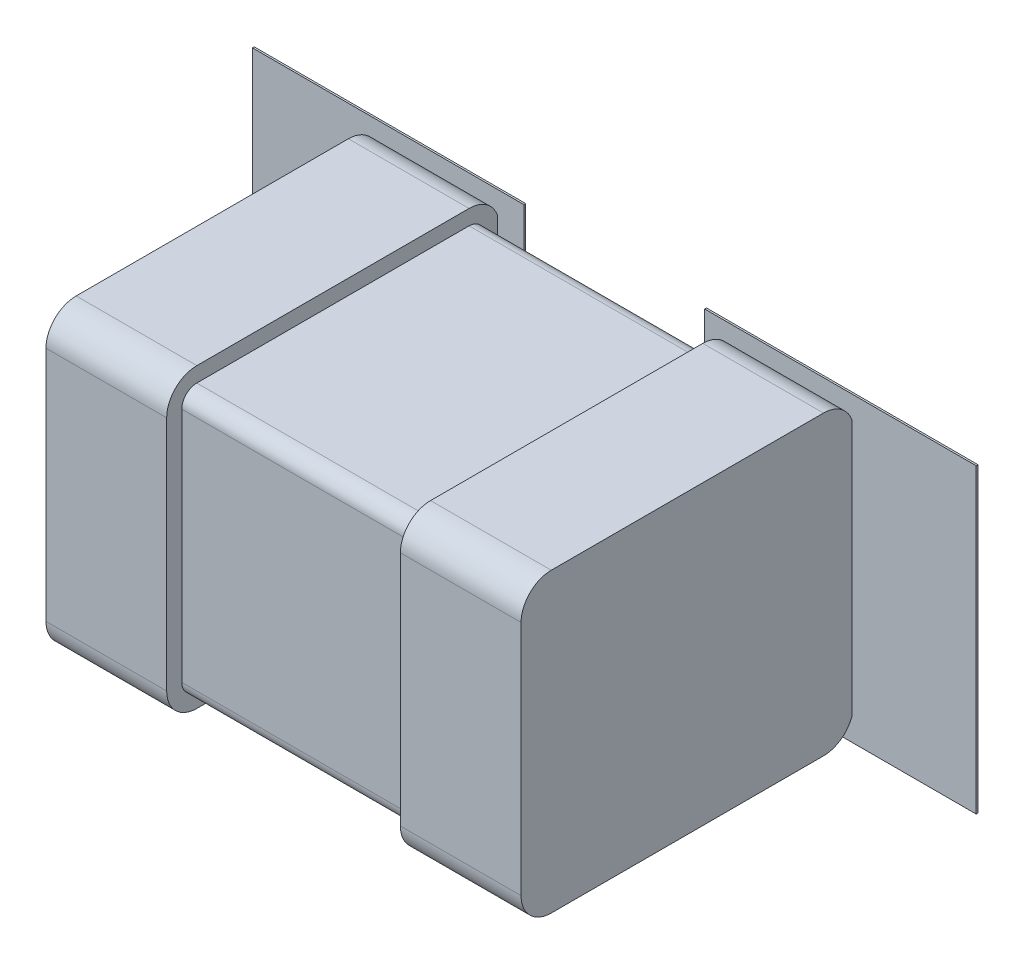
ISO-10303-21;
HEADER;
FILE_DESCRIPTION(('STEP AP214'),'2;1');
FILE_NAME('part.step','',(''),(''),'','','');
FILE_SCHEMA(('AUTOMOTIVE_DESIGN { 1 0 10303 214 1 1 1 1 }'));
ENDSEC;
DATA;
#1=APPLICATION_CONTEXT('core data for automotive mechanical design processes');
#2=APPLICATION_PROTOCOL_DEFINITION('international standard','automotive_design',2000,#1);
#3=PRODUCT_CONTEXT('',#1,'mechanical');
#4=PRODUCT('Part','Part','',(#3));
#5=PRODUCT_RELATED_PRODUCT_CATEGORY('part','',(#4));
#6=PRODUCT_DEFINITION_FORMATION('','',#4);
#7=PRODUCT_DEFINITION_CONTEXT('part definition',#1,'design');
#8=PRODUCT_DEFINITION('design','',#6,#7);
#9=PRODUCT_DEFINITION_SHAPE('','',#8);
#10=(LENGTH_UNIT() NAMED_UNIT(*) SI_UNIT(.MILLI.,.METRE.));
#11=(NAMED_UNIT(*) PLANE_ANGLE_UNIT() SI_UNIT($,.RADIAN.));
#12=(NAMED_UNIT(*) SI_UNIT($,.STERADIAN.) SOLID_ANGLE_UNIT());
#13=UNCERTAINTY_MEASURE_WITH_UNIT(LENGTH_MEASURE(1.E-05),#10,'distance_accuracy_value','');
#14=(GEOMETRIC_REPRESENTATION_CONTEXT(3) GLOBAL_UNCERTAINTY_ASSIGNED_CONTEXT((#13)) GLOBAL_UNIT_ASSIGNED_CONTEXT((#10,
#11,#12)) REPRESENTATION_CONTEXT('',''));
#15=CARTESIAN_POINT('',(0.,0.,0.));
#16=DIRECTION('',(0.,0.,1.));
#17=DIRECTION('',(1.,0.,0.));
#18=AXIS2_PLACEMENT_3D('',#15,#16,#17);
#19=CARTESIAN_POINT('',(0.,0.,0.0762));
#20=DIRECTION('',(0.,0.,1.));
#21=DIRECTION('',(1.,0.,0.));
#22=AXIS2_PLACEMENT_3D('',#19,#20,#21);
#23=PLANE('',#22);
#24=DIRECTION('',(0.,1.,0.));
#25=VECTOR('',#24,1.);
#26=CARTESIAN_POINT('',(0.380492,0.635,0.0762));
#27=LINE('',#26,#25);
#28=CARTESIAN_POINT('',(0.380492,0.635,0.0762));
#29=VERTEX_POINT('',#28);
#30=CARTESIAN_POINT('',(0.380492,-0.635,0.0762));
#31=VERTEX_POINT('',#30);
#32=EDGE_CURVE('E229',#29,#31,#27,.F.);
#33=ORIENTED_EDGE('',*,*,#32,.F.);
#34=DIRECTION('',(1.,0.,0.));
#35=VECTOR('',#34,1.);
#36=CARTESIAN_POINT('',(1.523492,0.635,0.0762));
#37=LINE('',#36,#35);
#38=CARTESIAN_POINT('',(1.523492,0.635,0.0762));
#39=VERTEX_POINT('',#38);
#40=EDGE_CURVE('E216',#39,#29,#37,.F.);
#41=ORIENTED_EDGE('',*,*,#40,.F.);
#42=DIRECTION('',(0.,1.,0.));
#43=VECTOR('',#42,1.);
#44=CARTESIAN_POINT('',(1.523492,-0.635,0.0762));
#45=LINE('',#44,#43);
#46=CARTESIAN_POINT('',(1.523492,-0.635,0.0762));
#47=VERTEX_POINT('',#46);
#48=EDGE_CURVE('E357',#47,#39,#45,.T.);
#49=ORIENTED_EDGE('',*,*,#48,.F.);
#50=DIRECTION('',(1.,0.,0.));
#51=VECTOR('',#50,1.);
#52=CARTESIAN_POINT('',(0.380492,-0.635,0.0762));
#53=LINE('',#52,#51);
#54=EDGE_CURVE('E230',#31,#47,#53,.T.);
#55=ORIENTED_EDGE('',*,*,#54,.F.);
#56=EDGE_LOOP('',(#33,#41,#49,#55));
#57=FACE_BOUND('',#56,.T.);
#58=ADVANCED_FACE('F17',(#57),#23,.F.);
#59=CARTESIAN_POINT('',(1.523492,0.635,0.0762));
#60=DIRECTION('',(0.,1.,0.));
#61=DIRECTION('',(0.,0.,1.));
#62=AXIS2_PLACEMENT_3D('',#59,#60,#61);
#63=PLANE('',#62);
#64=DIRECTION('',(0.,0.,-1.));
#65=VECTOR('',#64,1.);
#66=CARTESIAN_POINT('',(1.523492,0.635,0.0762));
#67=LINE('',#66,#65);
#68=CARTESIAN_POINT('',(1.523492,0.635,0.08382));
#69=VERTEX_POINT('',#68);
#70=EDGE_CURVE('E223',#39,#69,#67,.F.);
#71=ORIENTED_EDGE('',*,*,#70,.F.);
#72=ORIENTED_EDGE('',*,*,#40,.T.);
#73=DIRECTION('',(0.,0.,1.));
#74=VECTOR('',#73,1.);
#75=CARTESIAN_POINT('',(0.380492,0.635,0.0762));
#76=LINE('',#75,#74);
#77=CARTESIAN_POINT('',(0.380492,0.635,0.08382));
#78=VERTEX_POINT('',#77);
#79=EDGE_CURVE('E220',#78,#29,#76,.F.);
#80=ORIENTED_EDGE('',*,*,#79,.F.);
#81=DIRECTION('',(1.,0.,0.));
#82=VECTOR('',#81,1.);
#83=CARTESIAN_POINT('',(0.,0.635,0.08382));
#84=LINE('',#83,#82);
#85=EDGE_CURVE('E355',#69,#78,#84,.F.);
#86=ORIENTED_EDGE('',*,*,#85,.F.);
#87=EDGE_LOOP('',(#71,#72,#80,#86));
#88=FACE_BOUND('',#87,.T.);
#89=ADVANCED_FACE('F218',(#88),#63,.T.);
#90=CARTESIAN_POINT('',(0.380492,0.635,0.0762));
#91=DIRECTION('',(-1.,0.,0.));
#92=DIRECTION('',(0.,0.,1.));
#93=AXIS2_PLACEMENT_3D('',#90,#91,#92);
#94=PLANE('',#93);
#95=ORIENTED_EDGE('',*,*,#79,.T.);
#96=ORIENTED_EDGE('',*,*,#32,.T.);
#97=DIRECTION('',(0.,0.,-1.));
#98=VECTOR('',#97,1.);
#99=CARTESIAN_POINT('',(0.380492,-0.635,0.0762));
#100=LINE('',#99,#98);
#101=CARTESIAN_POINT('',(0.380492,-0.635,0.08382));
#102=VERTEX_POINT('',#101);
#103=EDGE_CURVE('E233',#102,#31,#100,.T.);
#104=ORIENTED_EDGE('',*,*,#103,.F.);
#105=DIRECTION('',(0.,1.,0.));
#106=VECTOR('',#105,1.);
#107=CARTESIAN_POINT('',(0.380492,0.,0.08382));
#108=LINE('',#107,#106);
#109=EDGE_CURVE('E237',#78,#102,#108,.F.);
#110=ORIENTED_EDGE('',*,*,#109,.F.);
#111=EDGE_LOOP('',(#95,#96,#104,#110));
#112=FACE_BOUND('',#111,.T.);
#113=ADVANCED_FACE('F235',(#112),#94,.T.);
#114=CARTESIAN_POINT('',(0.380492,-0.635,0.0762));
#115=DIRECTION('',(0.,-1.,0.));
#116=DIRECTION('',(0.,0.,-1.));
#117=AXIS2_PLACEMENT_3D('',#114,#115,#116);
#118=PLANE('',#117);
#119=ORIENTED_EDGE('',*,*,#103,.T.);
#120=ORIENTED_EDGE('',*,*,#54,.T.);
#121=DIRECTION('',(0.,0.,-1.));
#122=VECTOR('',#121,1.);
#123=CARTESIAN_POINT('',(1.523492,-0.635,0.0762));
#124=LINE('',#123,#122);
#125=CARTESIAN_POINT('',(1.523492,-0.635,0.08382));
#126=VERTEX_POINT('',#125);
#127=EDGE_CURVE('E192',#126,#47,#124,.T.);
#128=ORIENTED_EDGE('',*,*,#127,.F.);
#129=DIRECTION('',(1.,0.,0.));
#130=VECTOR('',#129,1.);
#131=CARTESIAN_POINT('',(0.,-0.635,0.08382));
#132=LINE('',#131,#130);
#133=EDGE_CURVE('E351',#102,#126,#132,.T.);
#134=ORIENTED_EDGE('',*,*,#133,.F.);
#135=EDGE_LOOP('',(#119,#120,#128,#134));
#136=FACE_BOUND('',#135,.T.);
#137=ADVANCED_FACE('F368',(#136),#118,.T.);
#138=CARTESIAN_POINT('',(1.523492,-0.635,0.0762));
#139=DIRECTION('',(1.,0.,0.));
#140=DIRECTION('',(0.,0.,-1.));
#141=AXIS2_PLACEMENT_3D('',#138,#139,#140);
#142=PLANE('',#141);
#143=ORIENTED_EDGE('',*,*,#127,.T.);
#144=ORIENTED_EDGE('',*,*,#48,.T.);
#145=ORIENTED_EDGE('',*,*,#70,.T.);
#146=DIRECTION('',(0.,1.,0.));
#147=VECTOR('',#146,1.);
#148=CARTESIAN_POINT('',(1.523492,0.,0.08382));
#149=LINE('',#148,#147);
#150=EDGE_CURVE('E348',#126,#69,#149,.T.);
#151=ORIENTED_EDGE('',*,*,#150,.F.);
#152=EDGE_LOOP('',(#143,#144,#145,#151));
#153=FACE_BOUND('',#152,.T.);
#154=ADVANCED_FACE('F372',(#153),#142,.T.);
#155=CARTESIAN_POINT('',(1.00000000000006,-0.62500000000004,0.0762));
#156=DIRECTION('',(1.,0.,0.));
#157=DIRECTION('',(0.,0.,-1.));
#158=AXIS2_PLACEMENT_3D('',#155,#156,#157);
#159=PLANE('',#158);
#160=CARTESIAN_POINT('',(1.00000000000006,-0.49800000000004,0.2032));
#161=DIRECTION('',(1.,0.,0.));
#162=DIRECTION('',(0.,0.,-1.));
#163=AXIS2_PLACEMENT_3D('',#160,#161,#162);
#164=CIRCLE('',#163,0.127);
#165=CARTESIAN_POINT('',(1.00000000000006,-0.541329154157453,0.083819999999987));
#166=VERTEX_POINT('',#165);
#167=CARTESIAN_POINT('',(1.00000000000006,-0.62500000000004,0.2032));
#168=VERTEX_POINT('',#167);
#169=EDGE_CURVE('E319',#166,#168,#164,.F.);
#170=ORIENTED_EDGE('',*,*,#169,.F.);
#171=DIRECTION('',(0.,1.,0.));
#172=VECTOR('',#171,1.);
#173=CARTESIAN_POINT('',(1.00000000000006,0.,0.08382));
#174=LINE('',#173,#172);
#175=CARTESIAN_POINT('',(1.00000000000006,0.541329154157453,0.083819999999987));
#176=VERTEX_POINT('',#175);
#177=EDGE_CURVE('E183',#176,#166,#174,.F.);
#178=ORIENTED_EDGE('',*,*,#177,.F.);
#179=CARTESIAN_POINT('',(1.00000000000006,0.49800000000004,0.2032));
#180=DIRECTION('',(1.,0.,0.));
#181=DIRECTION('',(0.,0.,-1.));
#182=AXIS2_PLACEMENT_3D('',#179,#180,#181);
#183=CIRCLE('',#182,0.127);
#184=CARTESIAN_POINT('',(1.00000000000006,0.62500000000004,0.2032));
#185=VERTEX_POINT('',#184);
#186=EDGE_CURVE('E20',#185,#176,#183,.F.);
#187=ORIENTED_EDGE('',*,*,#186,.F.);
#188=DIRECTION('',(0.,0.,1.));
#189=VECTOR('',#188,1.);
#190=CARTESIAN_POINT('',(1.00000000000006,0.62500000000004,0.0762));
#191=LINE('',#190,#189);
#192=CARTESIAN_POINT('',(1.00000000000006,0.62500000000004,1.349248));
#193=VERTEX_POINT('',#192);
#194=EDGE_CURVE('E337',#193,#185,#191,.F.);
#195=ORIENTED_EDGE('',*,*,#194,.F.);
#196=CARTESIAN_POINT('',(1.00000000000006,0.49800000000004,1.349248));
#197=DIRECTION('',(-1.,0.,0.));
#198=DIRECTION('',(0.,0.,1.));
#199=AXIS2_PLACEMENT_3D('',#196,#197,#198);
#200=CIRCLE('',#199,0.127);
#201=CARTESIAN_POINT('',(1.00000000000006,0.49800000000004,1.476248));
#202=VERTEX_POINT('',#201);
#203=EDGE_CURVE('E327',#202,#193,#200,.T.);
#204=ORIENTED_EDGE('',*,*,#203,.F.);
#205=DIRECTION('',(0.,1.,0.));
#206=VECTOR('',#205,1.);
#207=CARTESIAN_POINT('',(1.00000000000006,0.,1.476248));
#208=LINE('',#207,#206);
#209=CARTESIAN_POINT('',(1.00000000000006,-0.49800000000004,1.476248));
#210=VERTEX_POINT('',#209);
#211=EDGE_CURVE('E334',#210,#202,#208,.T.);
#212=ORIENTED_EDGE('',*,*,#211,.F.);
#213=CARTESIAN_POINT('',(1.00000000000006,-0.49800000000004,1.349248));
#214=DIRECTION('',(1.,0.,0.));
#215=DIRECTION('',(0.,0.,-1.));
#216=AXIS2_PLACEMENT_3D('',#213,#214,#215);
#217=CIRCLE('',#216,0.127);
#218=CARTESIAN_POINT('',(1.00000000000006,-0.62500000000004,1.349248));
#219=VERTEX_POINT('',#218);
#220=EDGE_CURVE('E323',#219,#210,#217,.F.);
#221=ORIENTED_EDGE('',*,*,#220,.F.);
#222=DIRECTION('',(0.,0.,-1.));
#223=VECTOR('',#222,1.);
#224=CARTESIAN_POINT('',(1.00000000000006,-0.62500000000004,0.0762));
#225=LINE('',#224,#223);
#226=EDGE_CURVE('E325',#168,#219,#225,.F.);
#227=ORIENTED_EDGE('',*,*,#226,.F.);
#228=EDGE_LOOP('',(#170,#178,#187,#195,#204,#212,#221,#227));
#229=FACE_BOUND('',#228,.T.);
#230=ADVANCED_FACE('F374',(#229),#159,.T.);
#231=CARTESIAN_POINT('',(0.,0.,0.08382));
#232=DIRECTION('',(0.,0.,1.));
#233=DIRECTION('',(1.,0.,0.));
#234=AXIS2_PLACEMENT_3D('',#231,#232,#233);
#235=PLANE('',#234);
#236=DIRECTION('',(1.,0.,0.));
#237=VECTOR('',#236,1.);
#238=CARTESIAN_POINT('',(1.00000000000006,0.541329154157417,0.083819999999974));
#239=LINE('',#238,#237);
#240=CARTESIAN_POINT('',(0.492000000000064,0.541329154157453,0.083819999999987));
#241=VERTEX_POINT('',#240);
#242=EDGE_CURVE('E345',#176,#241,#239,.F.);
#243=ORIENTED_EDGE('',*,*,#242,.F.);
#244=ORIENTED_EDGE('',*,*,#177,.T.);
#245=DIRECTION('',(1.,0.,0.));
#246=VECTOR('',#245,1.);
#247=CARTESIAN_POINT('',(1.00000000000006,-0.541329154157418,0.083819999999974));
#248=LINE('',#247,#246);
#249=CARTESIAN_POINT('',(0.492000000000064,-0.541329154157453,0.083819999999987));
#250=VERTEX_POINT('',#249);
#251=EDGE_CURVE('E322',#250,#166,#248,.T.);
#252=ORIENTED_EDGE('',*,*,#251,.F.);
#253=DIRECTION('',(0.,1.,0.));
#254=VECTOR('',#253,1.);
#255=CARTESIAN_POINT('',(0.492000000000064,0.56150000000004,0.0838200000000001));
#256=LINE('',#255,#254);
#257=EDGE_CURVE('E318',#250,#241,#256,.T.);
#258=ORIENTED_EDGE('',*,*,#257,.T.);
#259=EDGE_LOOP('',(#243,#244,#252,#258));
#260=FACE_BOUND('',#259,.T.);
#261=ORIENTED_EDGE('',*,*,#133,.T.);
#262=ORIENTED_EDGE('',*,*,#150,.T.);
#263=ORIENTED_EDGE('',*,*,#85,.T.);
#264=ORIENTED_EDGE('',*,*,#109,.T.);
#265=EDGE_LOOP('',(#261,#262,#263,#264));
#266=FACE_BOUND('',#265,.T.);
#267=ADVANCED_FACE('F370',(#260,#266),#235,.T.);
#268=CARTESIAN_POINT('',(1.00000000000006,0.49800000000004,0.2032));
#269=DIRECTION('',(1.,0.,0.));
#270=DIRECTION('',(0.,0.,-1.));
#271=AXIS2_PLACEMENT_3D('',#268,#269,#270);
#272=CYLINDRICAL_SURFACE('',#271,0.127);
#273=DIRECTION('',(1.,0.,0.));
#274=VECTOR('',#273,1.);
#275=CARTESIAN_POINT('',(1.00000000000006,0.62500000000004,0.2032));
#276=LINE('',#275,#274);
#277=CARTESIAN_POINT('',(0.492000000000064,0.62500000000004,0.2032));
#278=VERTEX_POINT('',#277);
#279=EDGE_CURVE('E330',#185,#278,#276,.F.);
#280=ORIENTED_EDGE('',*,*,#279,.F.);
#281=ORIENTED_EDGE('',*,*,#186,.T.);
#282=ORIENTED_EDGE('',*,*,#242,.T.);
#283=CARTESIAN_POINT('',(0.492000000000064,0.49800000000004,0.2032));
#284=DIRECTION('',(1.,0.,0.));
#285=DIRECTION('',(0.,0.,-1.));
#286=AXIS2_PLACEMENT_3D('',#283,#284,#285);
#287=CIRCLE('',#286,0.127);
#288=EDGE_CURVE('E316',#241,#278,#287,.T.);
#289=ORIENTED_EDGE('',*,*,#288,.T.);
#290=EDGE_LOOP('',(#280,#281,#282,#289));
#291=FACE_BOUND('',#290,.T.);
#292=ADVANCED_FACE('F503',(#291),#272,.T.);
#293=CARTESIAN_POINT('',(1.00000000000006,0.62500000000004,0.0762));
#294=DIRECTION('',(0.,1.,0.));
#295=DIRECTION('',(0.,0.,1.));
#296=AXIS2_PLACEMENT_3D('',#293,#294,#295);
#297=PLANE('',#296);
#298=ORIENTED_EDGE('',*,*,#194,.T.);
#299=ORIENTED_EDGE('',*,*,#279,.T.);
#300=DIRECTION('',(0.,0.,-1.));
#301=VECTOR('',#300,1.);
#302=CARTESIAN_POINT('',(0.492000000000064,0.62500000000004,1.476248));
#303=LINE('',#302,#301);
#304=CARTESIAN_POINT('',(0.492000000000064,0.62500000000004,1.349248));
#305=VERTEX_POINT('',#304);
#306=EDGE_CURVE('E315',#278,#305,#303,.F.);
#307=ORIENTED_EDGE('',*,*,#306,.T.);
#308=DIRECTION('',(-1.,0.,0.));
#309=VECTOR('',#308,1.);
#310=CARTESIAN_POINT('',(1.00534543368205,0.62500000000004,1.349248));
#311=LINE('',#310,#309);
#312=EDGE_CURVE('E329',#193,#305,#311,.T.);
#313=ORIENTED_EDGE('',*,*,#312,.F.);
#314=EDGE_LOOP('',(#298,#299,#307,#313));
#315=FACE_BOUND('',#314,.T.);
#316=ADVANCED_FACE('F500',(#315),#297,.T.);
#317=CARTESIAN_POINT('',(1.00534543368205,0.49800000000004,1.349248));
#318=DIRECTION('',(-1.,0.,0.));
#319=DIRECTION('',(0.,0.,1.));
#320=AXIS2_PLACEMENT_3D('',#317,#318,#319);
#321=CYLINDRICAL_SURFACE('',#320,0.127);
#322=ORIENTED_EDGE('',*,*,#312,.T.);
#323=CARTESIAN_POINT('',(0.492000000000064,0.49800000000004,1.349248));
#324=DIRECTION('',(-1.,0.,0.));
#325=DIRECTION('',(0.,0.,1.));
#326=AXIS2_PLACEMENT_3D('',#323,#324,#325);
#327=CIRCLE('',#326,0.127);
#328=CARTESIAN_POINT('',(0.492000000000064,0.49800000000004,1.476248));
#329=VERTEX_POINT('',#328);
#330=EDGE_CURVE('E313',#305,#329,#327,.F.);
#331=ORIENTED_EDGE('',*,*,#330,.T.);
#332=DIRECTION('',(1.,0.,0.));
#333=VECTOR('',#332,1.);
#334=CARTESIAN_POINT('',(0.,0.49800000000004,1.476248));
#335=LINE('',#334,#333);
#336=EDGE_CURVE('E363',#202,#329,#335,.F.);
#337=ORIENTED_EDGE('',*,*,#336,.F.);
#338=ORIENTED_EDGE('',*,*,#203,.T.);
#339=EDGE_LOOP('',(#322,#331,#337,#338));
#340=FACE_BOUND('',#339,.T.);
#341=ADVANCED_FACE('F496',(#340),#321,.T.);
#342=CARTESIAN_POINT('',(0.,0.,1.476248));
#343=DIRECTION('',(0.,0.,1.));
#344=DIRECTION('',(1.,0.,0.));
#345=AXIS2_PLACEMENT_3D('',#342,#343,#344);
#346=PLANE('',#345);
#347=ORIENTED_EDGE('',*,*,#211,.T.);
#348=ORIENTED_EDGE('',*,*,#336,.T.);
#349=DIRECTION('',(0.,1.,0.));
#350=VECTOR('',#349,1.);
#351=CARTESIAN_POINT('',(0.492000000000064,0.56150000000004,1.476248));
#352=LINE('',#351,#350);
#353=CARTESIAN_POINT('',(0.492000000000064,-0.49800000000004,1.476248));
#354=VERTEX_POINT('',#353);
#355=EDGE_CURVE('E312',#329,#354,#352,.F.);
#356=ORIENTED_EDGE('',*,*,#355,.T.);
#357=DIRECTION('',(1.,0.,0.));
#358=VECTOR('',#357,1.);
#359=CARTESIAN_POINT('',(-1.00555932044503,-0.49800000000004,1.476248));
#360=LINE('',#359,#358);
#361=EDGE_CURVE('E326',#210,#354,#360,.F.);
#362=ORIENTED_EDGE('',*,*,#361,.F.);
#363=EDGE_LOOP('',(#347,#348,#356,#362));
#364=FACE_BOUND('',#363,.T.);
#365=ADVANCED_FACE('F492',(#364),#346,.T.);
#366=CARTESIAN_POINT('',(-1.00555932044503,-0.49800000000004,1.349248));
#367=DIRECTION('',(1.,0.,0.));
#368=DIRECTION('',(0.,0.,-1.));
#369=AXIS2_PLACEMENT_3D('',#366,#367,#368);
#370=CYLINDRICAL_SURFACE('',#369,0.127);
#371=DIRECTION('',(1.,0.,0.));
#372=VECTOR('',#371,1.);
#373=CARTESIAN_POINT('',(-1.00000000000006,-0.62500000000004,1.349248));
#374=LINE('',#373,#372);
#375=CARTESIAN_POINT('',(0.492000000000064,-0.62500000000004,1.349248));
#376=VERTEX_POINT('',#375);
#377=EDGE_CURVE('E361',#219,#376,#374,.F.);
#378=ORIENTED_EDGE('',*,*,#377,.F.);
#379=ORIENTED_EDGE('',*,*,#220,.T.);
#380=ORIENTED_EDGE('',*,*,#361,.T.);
#381=CARTESIAN_POINT('',(0.492000000000064,-0.49800000000004,1.349248));
#382=DIRECTION('',(1.,0.,0.));
#383=DIRECTION('',(0.,0.,-1.));
#384=AXIS2_PLACEMENT_3D('',#381,#382,#383);
#385=CIRCLE('',#384,0.127);
#386=EDGE_CURVE('E310',#354,#376,#385,.T.);
#387=ORIENTED_EDGE('',*,*,#386,.T.);
#388=EDGE_LOOP('',(#378,#379,#380,#387));
#389=FACE_BOUND('',#388,.T.);
#390=ADVANCED_FACE('F488',(#389),#370,.T.);
#391=CARTESIAN_POINT('',(-1.00000000000006,-0.62500000000004,0.0762));
#392=DIRECTION('',(0.,-1.,0.));
#393=DIRECTION('',(0.,0.,-1.));
#394=AXIS2_PLACEMENT_3D('',#391,#392,#393);
#395=PLANE('',#394);
#396=DIRECTION('',(0.,0.,-1.));
#397=VECTOR('',#396,1.);
#398=CARTESIAN_POINT('',(0.492000000000064,-0.62500000000004,1.476248));
#399=LINE('',#398,#397);
#400=CARTESIAN_POINT('',(0.492000000000064,-0.62500000000004,0.2032));
#401=VERTEX_POINT('',#400);
#402=EDGE_CURVE('E309',#376,#401,#399,.T.);
#403=ORIENTED_EDGE('',*,*,#402,.T.);
#404=DIRECTION('',(1.,0.,0.));
#405=VECTOR('',#404,1.);
#406=CARTESIAN_POINT('',(1.00000000000006,-0.62500000000004,0.2032));
#407=LINE('',#406,#405);
#408=EDGE_CURVE('E526',#168,#401,#407,.F.);
#409=ORIENTED_EDGE('',*,*,#408,.F.);
#410=ORIENTED_EDGE('',*,*,#226,.T.);
#411=ORIENTED_EDGE('',*,*,#377,.T.);
#412=EDGE_LOOP('',(#403,#409,#410,#411));
#413=FACE_BOUND('',#412,.T.);
#414=ADVANCED_FACE('F484',(#413),#395,.T.);
#415=CARTESIAN_POINT('',(1.00000000000006,-0.49800000000004,0.2032));
#416=DIRECTION('',(1.,0.,0.));
#417=DIRECTION('',(0.,0.,-1.));
#418=AXIS2_PLACEMENT_3D('',#415,#416,#417);
#419=CYLINDRICAL_SURFACE('',#418,0.127);
#420=ORIENTED_EDGE('',*,*,#251,.T.);
#421=ORIENTED_EDGE('',*,*,#169,.T.);
#422=ORIENTED_EDGE('',*,*,#408,.T.);
#423=CARTESIAN_POINT('',(0.492000000000064,-0.49800000000004,0.2032));
#424=DIRECTION('',(1.,0.,0.));
#425=DIRECTION('',(0.,0.,-1.));
#426=AXIS2_PLACEMENT_3D('',#423,#424,#425);
#427=CIRCLE('',#426,0.127);
#428=EDGE_CURVE('E306',#401,#250,#427,.T.);
#429=ORIENTED_EDGE('',*,*,#428,.T.);
#430=EDGE_LOOP('',(#420,#421,#422,#429));
#431=FACE_BOUND('',#430,.T.);
#432=ADVANCED_FACE('F480',(#431),#419,.T.);
#433=CARTESIAN_POINT('',(0.492000000000064,0.56150000000004,1.476248));
#434=DIRECTION('',(1.,0.,0.));
#435=DIRECTION('',(0.,0.,-1.));
#436=AXIS2_PLACEMENT_3D('',#433,#434,#435);
#437=PLANE('',#436);
#438=DIRECTION('',(0.,0.,1.));
#439=VECTOR('',#438,1.);
#440=CARTESIAN_POINT('',(0.492000000000064,-0.56150000000004,1.476248));
#441=LINE('',#440,#439);
#442=CARTESIAN_POINT('',(0.492000000000064,-0.56150000000004,1.349248));
#443=VERTEX_POINT('',#442);
#444=CARTESIAN_POINT('',(0.492000000000064,-0.56150000000004,0.2032));
#445=VERTEX_POINT('',#444);
#446=EDGE_CURVE('E295',#443,#445,#441,.F.);
#447=ORIENTED_EDGE('',*,*,#446,.T.);
#448=CARTESIAN_POINT('',(0.492000000000064,-0.49800000000004,0.2032));
#449=DIRECTION('',(1.,0.,0.));
#450=DIRECTION('',(0.,0.,-1.));
#451=AXIS2_PLACEMENT_3D('',#448,#449,#450);
#452=CIRCLE('',#451,0.0635);
#453=CARTESIAN_POINT('',(0.492000000000064,-0.49800000000004,0.1397));
#454=VERTEX_POINT('',#453);
#455=EDGE_CURVE('E291',#454,#445,#452,.F.);
#456=ORIENTED_EDGE('',*,*,#455,.F.);
#457=DIRECTION('',(0.,1.,0.));
#458=VECTOR('',#457,1.);
#459=CARTESIAN_POINT('',(0.492000000000064,0.56150000000004,0.1397));
#460=LINE('',#459,#458);
#461=CARTESIAN_POINT('',(0.492000000000064,0.49800000000004,0.1397));
#462=VERTEX_POINT('',#461);
#463=EDGE_CURVE('E537',#454,#462,#460,.T.);
#464=ORIENTED_EDGE('',*,*,#463,.T.);
#465=CARTESIAN_POINT('',(0.492000000000064,0.49800000000004,0.2032));
#466=DIRECTION('',(-1.,0.,0.));
#467=DIRECTION('',(0.,0.,1.));
#468=AXIS2_PLACEMENT_3D('',#465,#466,#467);
#469=CIRCLE('',#468,0.0635);
#470=CARTESIAN_POINT('',(0.492000000000064,0.56150000000004,0.2032));
#471=VERTEX_POINT('',#470);
#472=EDGE_CURVE('E286',#471,#462,#469,.T.);
#473=ORIENTED_EDGE('',*,*,#472,.F.);
#474=DIRECTION('',(0.,0.,-1.));
#475=VECTOR('',#474,1.);
#476=CARTESIAN_POINT('',(0.492000000000064,0.56150000000004,1.476248));
#477=LINE('',#476,#475);
#478=CARTESIAN_POINT('',(0.492000000000064,0.56150000000004,1.349248));
#479=VERTEX_POINT('',#478);
#480=EDGE_CURVE('E305',#471,#479,#477,.F.);
#481=ORIENTED_EDGE('',*,*,#480,.T.);
#482=CARTESIAN_POINT('',(0.492000000000064,0.49800000000004,1.349248));
#483=DIRECTION('',(1.,0.,0.));
#484=DIRECTION('',(0.,0.,-1.));
#485=AXIS2_PLACEMENT_3D('',#482,#483,#484);
#486=CIRCLE('',#485,0.0635);
#487=CARTESIAN_POINT('',(0.492000000000064,0.49800000000004,1.412748));
#488=VERTEX_POINT('',#487);
#489=EDGE_CURVE('E301',#488,#479,#486,.F.);
#490=ORIENTED_EDGE('',*,*,#489,.F.);
#491=DIRECTION('',(0.,1.,0.));
#492=VECTOR('',#491,1.);
#493=CARTESIAN_POINT('',(0.492000000000064,0.56150000000004,1.412748));
#494=LINE('',#493,#492);
#495=CARTESIAN_POINT('',(0.492000000000064,-0.49800000000004,1.412748));
#496=VERTEX_POINT('',#495);
#497=EDGE_CURVE('E300',#488,#496,#494,.F.);
#498=ORIENTED_EDGE('',*,*,#497,.T.);
#499=CARTESIAN_POINT('',(0.492000000000064,-0.49800000000004,1.349248));
#500=DIRECTION('',(-1.,0.,0.));
#501=DIRECTION('',(0.,0.,1.));
#502=AXIS2_PLACEMENT_3D('',#499,#500,#501);
#503=CIRCLE('',#502,0.0635);
#504=EDGE_CURVE('E296',#443,#496,#503,.T.);
#505=ORIENTED_EDGE('',*,*,#504,.F.);
#506=EDGE_LOOP('',(#447,#456,#464,#473,#481,#490,#498,#505));
#507=FACE_BOUND('',#506,.T.);
#508=ORIENTED_EDGE('',*,*,#402,.F.);
#509=ORIENTED_EDGE('',*,*,#386,.F.);
#510=ORIENTED_EDGE('',*,*,#355,.F.);
#511=ORIENTED_EDGE('',*,*,#330,.F.);
#512=ORIENTED_EDGE('',*,*,#306,.F.);
#513=ORIENTED_EDGE('',*,*,#288,.F.);
#514=ORIENTED_EDGE('',*,*,#257,.F.);
#515=ORIENTED_EDGE('',*,*,#428,.F.);
#516=EDGE_LOOP('',(#508,#509,#510,#511,#512,#513,#514,#515));
#517=FACE_BOUND('',#516,.T.);
#518=ADVANCED_FACE('F476',(#507,#517),#437,.F.);
#519=CARTESIAN_POINT('',(0.,0.,0.0762));
#520=DIRECTION('',(0.,0.,1.));
#521=DIRECTION('',(1.,0.,0.));
#522=AXIS2_PLACEMENT_3D('',#519,#520,#521);
#523=PLANE('',#522);
#524=DIRECTION('',(0.,1.,0.));
#525=VECTOR('',#524,1.);
#526=CARTESIAN_POINT('',(-0.380492,-0.635,0.0762));
#527=LINE('',#526,#525);
#528=CARTESIAN_POINT('',(-0.380492,-0.635,0.0762));
#529=VERTEX_POINT('',#528);
#530=CARTESIAN_POINT('',(-0.380492,0.635,0.0762));
#531=VERTEX_POINT('',#530);
#532=EDGE_CURVE('E577',#529,#531,#527,.T.);
#533=ORIENTED_EDGE('',*,*,#532,.F.);
#534=DIRECTION('',(1.,0.,0.));
#535=VECTOR('',#534,1.);
#536=CARTESIAN_POINT('',(-1.523492,-0.635,0.0762));
#537=LINE('',#536,#535);
#538=CARTESIAN_POINT('',(-1.523492,-0.635,0.0762));
#539=VERTEX_POINT('',#538);
#540=EDGE_CURVE('E565',#539,#529,#537,.T.);
#541=ORIENTED_EDGE('',*,*,#540,.F.);
#542=DIRECTION('',(0.,1.,0.));
#543=VECTOR('',#542,1.);
#544=CARTESIAN_POINT('',(-1.523492,0.635,0.0762));
#545=LINE('',#544,#543);
#546=CARTESIAN_POINT('',(-1.523492,0.635,0.0762));
#547=VERTEX_POINT('',#546);
#548=EDGE_CURVE('E592',#547,#539,#545,.F.);
#549=ORIENTED_EDGE('',*,*,#548,.F.);
#550=DIRECTION('',(1.,0.,0.));
#551=VECTOR('',#550,1.);
#552=CARTESIAN_POINT('',(-0.380492,0.635,0.0762));
#553=LINE('',#552,#551);
#554=EDGE_CURVE('E583',#531,#547,#553,.F.);
#555=ORIENTED_EDGE('',*,*,#554,.F.);
#556=EDGE_LOOP('',(#533,#541,#549,#555));
#557=FACE_BOUND('',#556,.T.);
#558=ADVANCED_FACE('F472',(#557),#523,.F.);
#559=CARTESIAN_POINT('',(-0.492000000000064,0.56150000000004,1.476248));
#560=DIRECTION('',(0.,-1.,0.));
#561=DIRECTION('',(0.,0.,-1.));
#562=AXIS2_PLACEMENT_3D('',#559,#560,#561);
#563=PLANE('',#562);
#564=DIRECTION('',(1.,0.,0.));
#565=VECTOR('',#564,1.);
#566=CARTESIAN_POINT('',(-0.49782743813155,0.56150000000004,1.349248));
#567=LINE('',#566,#565);
#568=CARTESIAN_POINT('',(-0.492000000000064,0.56150000000004,1.349248));
#569=VERTEX_POINT('',#568);
#570=EDGE_CURVE('E304',#479,#569,#567,.F.);
#571=ORIENTED_EDGE('',*,*,#570,.F.);
#572=ORIENTED_EDGE('',*,*,#480,.F.);
#573=DIRECTION('',(-1.,0.,0.));
#574=VECTOR('',#573,1.);
#575=CARTESIAN_POINT('',(0.497345433682048,0.56150000000004,0.2032));
#576=LINE('',#575,#574);
#577=CARTESIAN_POINT('',(-0.492000000000064,0.56150000000004,0.2032));
#578=VERTEX_POINT('',#577);
#579=EDGE_CURVE('E290',#578,#471,#576,.F.);
#580=ORIENTED_EDGE('',*,*,#579,.F.);
#581=DIRECTION('',(0.,0.,1.));
#582=VECTOR('',#581,1.);
#583=CARTESIAN_POINT('',(-0.492000000000064,0.56150000000004,1.476248));
#584=LINE('',#583,#582);
#585=EDGE_CURVE('E285',#578,#569,#584,.T.);
#586=ORIENTED_EDGE('',*,*,#585,.T.);
#587=EDGE_LOOP('',(#571,#572,#580,#586));
#588=FACE_BOUND('',#587,.T.);
#589=ADVANCED_FACE('F468',(#588),#563,.F.);
#590=CARTESIAN_POINT('',(-0.49782743813155,0.49800000000004,1.349248));
#591=DIRECTION('',(1.,0.,0.));
#592=DIRECTION('',(0.,0.,-1.));
#593=AXIS2_PLACEMENT_3D('',#590,#591,#592);
#594=CYLINDRICAL_SURFACE('',#593,0.0635);
#595=CARTESIAN_POINT('',(-0.492000000000064,0.49800000000004,1.349248));
#596=DIRECTION('',(1.,0.,0.));
#597=DIRECTION('',(0.,0.,-1.));
#598=AXIS2_PLACEMENT_3D('',#595,#596,#597);
#599=CIRCLE('',#598,0.0635);
#600=CARTESIAN_POINT('',(-0.492000000000064,0.49800000000004,1.412748));
#601=VERTEX_POINT('',#600);
#602=EDGE_CURVE('E283',#569,#601,#599,.T.);
#603=ORIENTED_EDGE('',*,*,#602,.T.);
#604=DIRECTION('',(-1.,0.,0.));
#605=VECTOR('',#604,1.);
#606=CARTESIAN_POINT('',(0.492000000000064,0.49800000000004,1.412748));
#607=LINE('',#606,#605);
#608=EDGE_CURVE('E544',#601,#488,#607,.F.);
#609=ORIENTED_EDGE('',*,*,#608,.T.);
#610=ORIENTED_EDGE('',*,*,#489,.T.);
#611=ORIENTED_EDGE('',*,*,#570,.T.);
#612=EDGE_LOOP('',(#603,#609,#610,#611));
#613=FACE_BOUND('',#612,.T.);
#614=ADVANCED_FACE('F464',(#613),#594,.T.);
#615=CARTESIAN_POINT('',(0.492000000000064,0.56150000000004,1.412748));
#616=DIRECTION('',(0.,0.,-1.));
#617=DIRECTION('',(-1.,0.,0.));
#618=AXIS2_PLACEMENT_3D('',#615,#616,#617);
#619=PLANE('',#618);
#620=DIRECTION('',(-1.,0.,0.));
#621=VECTOR('',#620,1.);
#622=CARTESIAN_POINT('',(0.497559320445028,-0.49800000000004,1.412748));
#623=LINE('',#622,#621);
#624=CARTESIAN_POINT('',(-0.492000000000064,-0.49800000000004,1.412748));
#625=VERTEX_POINT('',#624);
#626=EDGE_CURVE('E299',#496,#625,#623,.T.);
#627=ORIENTED_EDGE('',*,*,#626,.F.);
#628=ORIENTED_EDGE('',*,*,#497,.F.);
#629=ORIENTED_EDGE('',*,*,#608,.F.);
#630=DIRECTION('',(0.,1.,0.));
#631=VECTOR('',#630,1.);
#632=CARTESIAN_POINT('',(-0.492000000000064,0.62500000000004,1.412748));
#633=LINE('',#632,#631);
#634=EDGE_CURVE('E282',#601,#625,#633,.F.);
#635=ORIENTED_EDGE('',*,*,#634,.T.);
#636=EDGE_LOOP('',(#627,#628,#629,#635));
#637=FACE_BOUND('',#636,.T.);
#638=ADVANCED_FACE('F460',(#637),#619,.F.);
#639=CARTESIAN_POINT('',(0.497559320445028,-0.49800000000004,1.349248));
#640=DIRECTION('',(-1.,0.,0.));
#641=DIRECTION('',(0.,0.,1.));
#642=AXIS2_PLACEMENT_3D('',#639,#640,#641);
#643=CYLINDRICAL_SURFACE('',#642,0.0635);
#644=ORIENTED_EDGE('',*,*,#504,.T.);
#645=ORIENTED_EDGE('',*,*,#626,.T.);
#646=CARTESIAN_POINT('',(-0.492000000000064,-0.49800000000004,1.349248));
#647=DIRECTION('',(-1.,0.,0.));
#648=DIRECTION('',(0.,0.,1.));
#649=AXIS2_PLACEMENT_3D('',#646,#647,#648);
#650=CIRCLE('',#649,0.0635);
#651=CARTESIAN_POINT('',(-0.492000000000064,-0.56150000000004,1.349248));
#652=VERTEX_POINT('',#651);
#653=EDGE_CURVE('E280',#625,#652,#650,.F.);
#654=ORIENTED_EDGE('',*,*,#653,.T.);
#655=DIRECTION('',(1.,0.,0.));
#656=VECTOR('',#655,1.);
#657=CARTESIAN_POINT('',(0.492000000000064,-0.56150000000004,1.349248));
#658=LINE('',#657,#656);
#659=EDGE_CURVE('E543',#652,#443,#658,.T.);
#660=ORIENTED_EDGE('',*,*,#659,.T.);
#661=EDGE_LOOP('',(#644,#645,#654,#660));
#662=FACE_BOUND('',#661,.T.);
#663=ADVANCED_FACE('F456',(#662),#643,.T.);
#664=CARTESIAN_POINT('',(0.492000000000064,-0.56150000000004,1.476248));
#665=DIRECTION('',(0.,1.,0.));
#666=DIRECTION('',(0.,0.,1.));
#667=AXIS2_PLACEMENT_3D('',#664,#665,#666);
#668=PLANE('',#667);
#669=DIRECTION('',(1.,0.,0.));
#670=VECTOR('',#669,1.);
#671=CARTESIAN_POINT('',(-0.497345433682048,-0.56150000000004,0.2032));
#672=LINE('',#671,#670);
#673=CARTESIAN_POINT('',(-0.492000000000064,-0.56150000000004,0.2032));
#674=VERTEX_POINT('',#673);
#675=EDGE_CURVE('E294',#445,#674,#672,.F.);
#676=ORIENTED_EDGE('',*,*,#675,.F.);
#677=ORIENTED_EDGE('',*,*,#446,.F.);
#678=ORIENTED_EDGE('',*,*,#659,.F.);
#679=DIRECTION('',(0.,0.,1.));
#680=VECTOR('',#679,1.);
#681=CARTESIAN_POINT('',(-0.492000000000064,-0.56150000000004,1.476248));
#682=LINE('',#681,#680);
#683=EDGE_CURVE('E279',#652,#674,#682,.F.);
#684=ORIENTED_EDGE('',*,*,#683,.T.);
#685=EDGE_LOOP('',(#676,#677,#678,#684));
#686=FACE_BOUND('',#685,.T.);
#687=ADVANCED_FACE('F452',(#686),#668,.F.);
#688=CARTESIAN_POINT('',(-0.497345433682048,-0.49800000000004,0.2032));
#689=DIRECTION('',(1.,0.,0.));
#690=DIRECTION('',(0.,0.,-1.));
#691=AXIS2_PLACEMENT_3D('',#688,#689,#690);
#692=CYLINDRICAL_SURFACE('',#691,0.0635);
#693=CARTESIAN_POINT('',(-0.492000000000064,-0.49800000000004,0.2032));
#694=DIRECTION('',(1.,0.,0.));
#695=DIRECTION('',(0.,0.,-1.));
#696=AXIS2_PLACEMENT_3D('',#693,#694,#695);
#697=CIRCLE('',#696,0.0635);
#698=CARTESIAN_POINT('',(-0.492000000000064,-0.49800000000004,0.1397));
#699=VERTEX_POINT('',#698);
#700=EDGE_CURVE('E277',#674,#699,#697,.T.);
#701=ORIENTED_EDGE('',*,*,#700,.T.);
#702=DIRECTION('',(1.,0.,0.));
#703=VECTOR('',#702,1.);
#704=CARTESIAN_POINT('',(-0.492000000000064,-0.49800000000004,0.1397));
#705=LINE('',#704,#703);
#706=EDGE_CURVE('E558',#699,#454,#705,.T.);
#707=ORIENTED_EDGE('',*,*,#706,.T.);
#708=ORIENTED_EDGE('',*,*,#455,.T.);
#709=ORIENTED_EDGE('',*,*,#675,.T.);
#710=EDGE_LOOP('',(#701,#707,#708,#709));
#711=FACE_BOUND('',#710,.T.);
#712=ADVANCED_FACE('F448',(#711),#692,.T.);
#713=CARTESIAN_POINT('',(-0.492000000000064,0.56150000000004,0.1397));
#714=DIRECTION('',(0.,0.,1.));
#715=DIRECTION('',(1.,0.,0.));
#716=AXIS2_PLACEMENT_3D('',#713,#714,#715);
#717=PLANE('',#716);
#718=ORIENTED_EDGE('',*,*,#706,.F.);
#719=DIRECTION('',(0.,1.,0.));
#720=VECTOR('',#719,1.);
#721=CARTESIAN_POINT('',(-0.492000000000064,0.62500000000004,0.1397));
#722=LINE('',#721,#720);
#723=CARTESIAN_POINT('',(-0.492000000000064,0.49800000000004,0.1397));
#724=VERTEX_POINT('',#723);
#725=EDGE_CURVE('E276',#699,#724,#722,.T.);
#726=ORIENTED_EDGE('',*,*,#725,.T.);
#727=DIRECTION('',(-1.,0.,0.));
#728=VECTOR('',#727,1.);
#729=CARTESIAN_POINT('',(0.497345433682048,0.49800000000004,0.1397));
#730=LINE('',#729,#728);
#731=EDGE_CURVE('E289',#462,#724,#730,.T.);
#732=ORIENTED_EDGE('',*,*,#731,.F.);
#733=ORIENTED_EDGE('',*,*,#463,.F.);
#734=EDGE_LOOP('',(#718,#726,#732,#733));
#735=FACE_BOUND('',#734,.T.);
#736=ADVANCED_FACE('F444',(#735),#717,.F.);
#737=CARTESIAN_POINT('',(0.497345433682048,0.49800000000004,0.2032));
#738=DIRECTION('',(-1.,0.,0.));
#739=DIRECTION('',(0.,0.,1.));
#740=AXIS2_PLACEMENT_3D('',#737,#738,#739);
#741=CYLINDRICAL_SURFACE('',#740,0.0635);
#742=ORIENTED_EDGE('',*,*,#472,.T.);
#743=ORIENTED_EDGE('',*,*,#731,.T.);
#744=CARTESIAN_POINT('',(-0.492000000000064,0.49800000000004,0.2032));
#745=DIRECTION('',(-1.,0.,0.));
#746=DIRECTION('',(0.,0.,1.));
#747=AXIS2_PLACEMENT_3D('',#744,#745,#746);
#748=CIRCLE('',#747,0.0635);
#749=EDGE_CURVE('E273',#724,#578,#748,.F.);
#750=ORIENTED_EDGE('',*,*,#749,.T.);
#751=ORIENTED_EDGE('',*,*,#579,.T.);
#752=EDGE_LOOP('',(#742,#743,#750,#751));
#753=FACE_BOUND('',#752,.T.);
#754=ADVANCED_FACE('F440',(#753),#741,.T.);
#755=CARTESIAN_POINT('',(-1.523492,-0.635,0.0762));
#756=DIRECTION('',(0.,-1.,0.));
#757=DIRECTION('',(0.,0.,-1.));
#758=AXIS2_PLACEMENT_3D('',#755,#756,#757);
#759=PLANE('',#758);
#760=DIRECTION('',(0.,0.,1.));
#761=VECTOR('',#760,1.);
#762=CARTESIAN_POINT('',(-1.523492,-0.635,0.0762));
#763=LINE('',#762,#761);
#764=CARTESIAN_POINT('',(-1.523492,-0.635,0.08382));
#765=VERTEX_POINT('',#764);
#766=EDGE_CURVE('E586',#539,#765,#763,.T.);
#767=ORIENTED_EDGE('',*,*,#766,.F.);
#768=ORIENTED_EDGE('',*,*,#540,.T.);
#769=DIRECTION('',(0.,0.,-1.));
#770=VECTOR('',#769,1.);
#771=CARTESIAN_POINT('',(-0.380492,-0.635,0.0762));
#772=LINE('',#771,#770);
#773=CARTESIAN_POINT('',(-0.380492,-0.635,0.08382));
#774=VERTEX_POINT('',#773);
#775=EDGE_CURVE('E574',#774,#529,#772,.T.);
#776=ORIENTED_EDGE('',*,*,#775,.F.);
#777=DIRECTION('',(1.,0.,0.));
#778=VECTOR('',#777,1.);
#779=CARTESIAN_POINT('',(0.,-0.635,0.08382));
#780=LINE('',#779,#778);
#781=EDGE_CURVE('E259',#765,#774,#780,.T.);
#782=ORIENTED_EDGE('',*,*,#781,.F.);
#783=EDGE_LOOP('',(#767,#768,#776,#782));
#784=FACE_BOUND('',#783,.T.);
#785=ADVANCED_FACE('F436',(#784),#759,.T.);
#786=CARTESIAN_POINT('',(-0.380492,-0.635,0.0762));
#787=DIRECTION('',(1.,0.,0.));
#788=DIRECTION('',(0.,0.,-1.));
#789=AXIS2_PLACEMENT_3D('',#786,#787,#788);
#790=PLANE('',#789);
#791=ORIENTED_EDGE('',*,*,#775,.T.);
#792=ORIENTED_EDGE('',*,*,#532,.T.);
#793=DIRECTION('',(0.,0.,1.));
#794=VECTOR('',#793,1.);
#795=CARTESIAN_POINT('',(-0.380492,0.635,0.0762));
#796=LINE('',#795,#794);
#797=CARTESIAN_POINT('',(-0.380492,0.635,0.08382));
#798=VERTEX_POINT('',#797);
#799=EDGE_CURVE('E580',#798,#531,#796,.F.);
#800=ORIENTED_EDGE('',*,*,#799,.F.);
#801=DIRECTION('',(0.,1.,0.));
#802=VECTOR('',#801,1.);
#803=CARTESIAN_POINT('',(-0.380492,0.,0.08382));
#804=LINE('',#803,#802);
#805=EDGE_CURVE('E620',#774,#798,#804,.T.);
#806=ORIENTED_EDGE('',*,*,#805,.F.);
#807=EDGE_LOOP('',(#791,#792,#800,#806));
#808=FACE_BOUND('',#807,.T.);
#809=ADVANCED_FACE('F432',(#808),#790,.T.);
#810=CARTESIAN_POINT('',(-0.380492,0.635,0.0762));
#811=DIRECTION('',(0.,1.,0.));
#812=DIRECTION('',(0.,0.,1.));
#813=AXIS2_PLACEMENT_3D('',#810,#811,#812);
#814=PLANE('',#813);
#815=ORIENTED_EDGE('',*,*,#799,.T.);
#816=ORIENTED_EDGE('',*,*,#554,.T.);
#817=DIRECTION('',(0.,0.,1.));
#818=VECTOR('',#817,1.);
#819=CARTESIAN_POINT('',(-1.523492,0.635,0.0762));
#820=LINE('',#819,#818);
#821=CARTESIAN_POINT('',(-1.523492,0.635,0.08382));
#822=VERTEX_POINT('',#821);
#823=EDGE_CURVE('E589',#822,#547,#820,.F.);
#824=ORIENTED_EDGE('',*,*,#823,.F.);
#825=DIRECTION('',(1.,0.,0.));
#826=VECTOR('',#825,1.);
#827=CARTESIAN_POINT('',(0.,0.635,0.08382));
#828=LINE('',#827,#826);
#829=EDGE_CURVE('E623',#798,#822,#828,.F.);
#830=ORIENTED_EDGE('',*,*,#829,.F.);
#831=EDGE_LOOP('',(#815,#816,#824,#830));
#832=FACE_BOUND('',#831,.T.);
#833=ADVANCED_FACE('F428',(#832),#814,.T.);
#834=CARTESIAN_POINT('',(-1.523492,0.635,0.0762));
#835=DIRECTION('',(-1.,0.,0.));
#836=DIRECTION('',(0.,0.,1.));
#837=AXIS2_PLACEMENT_3D('',#834,#835,#836);
#838=PLANE('',#837);
#839=ORIENTED_EDGE('',*,*,#823,.T.);
#840=ORIENTED_EDGE('',*,*,#548,.T.);
#841=ORIENTED_EDGE('',*,*,#766,.T.);
#842=DIRECTION('',(0.,1.,0.));
#843=VECTOR('',#842,1.);
#844=CARTESIAN_POINT('',(-1.523492,0.,0.08382));
#845=LINE('',#844,#843);
#846=EDGE_CURVE('E617',#822,#765,#845,.F.);
#847=ORIENTED_EDGE('',*,*,#846,.F.);
#848=EDGE_LOOP('',(#839,#840,#841,#847));
#849=FACE_BOUND('',#848,.T.);
#850=ADVANCED_FACE('F424',(#849),#838,.T.);
#851=CARTESIAN_POINT('',(-0.492000000000064,0.62500000000004,1.476248));
#852=DIRECTION('',(-1.,0.,0.));
#853=DIRECTION('',(0.,0.,1.));
#854=AXIS2_PLACEMENT_3D('',#851,#852,#853);
#855=PLANE('',#854);
#856=ORIENTED_EDGE('',*,*,#725,.F.);
#857=ORIENTED_EDGE('',*,*,#700,.F.);
#858=ORIENTED_EDGE('',*,*,#683,.F.);
#859=ORIENTED_EDGE('',*,*,#653,.F.);
#860=ORIENTED_EDGE('',*,*,#634,.F.);
#861=ORIENTED_EDGE('',*,*,#602,.F.);
#862=ORIENTED_EDGE('',*,*,#585,.F.);
#863=ORIENTED_EDGE('',*,*,#749,.F.);
#864=EDGE_LOOP('',(#856,#857,#858,#859,#860,#861,#862,#863));
#865=FACE_BOUND('',#864,.T.);
#866=DIRECTION('',(0.,0.,1.));
#867=VECTOR('',#866,1.);
#868=CARTESIAN_POINT('',(-0.492000000000064,0.62500000000004,0.0762));
#869=LINE('',#868,#867);
#870=CARTESIAN_POINT('',(-0.492000000000064,0.62500000000004,1.349248));
#871=VERTEX_POINT('',#870);
#872=CARTESIAN_POINT('',(-0.492000000000064,0.62500000000004,0.2032));
#873=VERTEX_POINT('',#872);
#874=EDGE_CURVE('E570',#871,#873,#869,.F.);
#875=ORIENTED_EDGE('',*,*,#874,.F.);
#876=CARTESIAN_POINT('',(-0.492000000000064,0.49800000000004,1.349248));
#877=DIRECTION('',(-1.,0.,0.));
#878=DIRECTION('',(0.,0.,1.));
#879=AXIS2_PLACEMENT_3D('',#876,#877,#878);
#880=CIRCLE('',#879,0.127);
#881=CARTESIAN_POINT('',(-0.492000000000064,0.49800000000004,1.476248));
#882=VERTEX_POINT('',#881);
#883=EDGE_CURVE('E261',#882,#871,#880,.T.);
#884=ORIENTED_EDGE('',*,*,#883,.F.);
#885=DIRECTION('',(0.,1.,0.));
#886=VECTOR('',#885,1.);
#887=CARTESIAN_POINT('',(-0.492000000000064,0.,1.476248));
#888=LINE('',#887,#886);
#889=CARTESIAN_POINT('',(-0.492000000000064,-0.49800000000004,1.476248));
#890=VERTEX_POINT('',#889);
#891=EDGE_CURVE('E568',#890,#882,#888,.T.);
#892=ORIENTED_EDGE('',*,*,#891,.F.);
#893=CARTESIAN_POINT('',(-0.492000000000064,-0.49800000000004,1.349248));
#894=DIRECTION('',(1.,0.,0.));
#895=DIRECTION('',(0.,0.,-1.));
#896=AXIS2_PLACEMENT_3D('',#893,#894,#895);
#897=CIRCLE('',#896,0.127);
#898=CARTESIAN_POINT('',(-0.492000000000064,-0.62500000000004,1.349248));
#899=VERTEX_POINT('',#898);
#900=EDGE_CURVE('E265',#899,#890,#897,.F.);
#901=ORIENTED_EDGE('',*,*,#900,.F.);
#902=DIRECTION('',(0.,0.,-1.));
#903=VECTOR('',#902,1.);
#904=CARTESIAN_POINT('',(-0.492000000000064,-0.62500000000004,0.0762));
#905=LINE('',#904,#903);
#906=CARTESIAN_POINT('',(-0.492000000000064,-0.62500000000004,0.2032));
#907=VERTEX_POINT('',#906);
#908=EDGE_CURVE('E272',#907,#899,#905,.F.);
#909=ORIENTED_EDGE('',*,*,#908,.F.);
#910=CARTESIAN_POINT('',(-0.492000000000064,-0.49800000000004,0.2032));
#911=DIRECTION('',(1.,0.,0.));
#912=DIRECTION('',(0.,0.,-1.));
#913=AXIS2_PLACEMENT_3D('',#910,#911,#912);
#914=CIRCLE('',#913,0.127);
#915=CARTESIAN_POINT('',(-0.492000000000064,-0.541329154157449,0.08382));
#916=VERTEX_POINT('',#915);
#917=EDGE_CURVE('E269',#916,#907,#914,.F.);
#918=ORIENTED_EDGE('',*,*,#917,.F.);
#919=DIRECTION('',(0.,1.,0.));
#920=VECTOR('',#919,1.);
#921=CARTESIAN_POINT('',(-0.492000000000064,0.,0.08382));
#922=LINE('',#921,#920);
#923=CARTESIAN_POINT('',(-0.492000000000064,0.541329154157449,0.08382));
#924=VERTEX_POINT('',#923);
#925=EDGE_CURVE('E599',#924,#916,#922,.F.);
#926=ORIENTED_EDGE('',*,*,#925,.F.);
#927=CARTESIAN_POINT('',(-0.492000000000064,0.49800000000004,0.2032));
#928=DIRECTION('',(1.,0.,0.));
#929=DIRECTION('',(0.,0.,-1.));
#930=AXIS2_PLACEMENT_3D('',#927,#928,#929);
#931=CIRCLE('',#930,0.127);
#932=EDGE_CURVE('E257',#873,#924,#931,.F.);
#933=ORIENTED_EDGE('',*,*,#932,.F.);
#934=EDGE_LOOP('',(#875,#884,#892,#901,#909,#918,#926,#933));
#935=FACE_BOUND('',#934,.T.);
#936=ADVANCED_FACE('F420',(#865,#935),#855,.F.);
#937=CARTESIAN_POINT('',(1.00000000000006,-0.49800000000004,0.2032));
#938=DIRECTION('',(1.,0.,0.));
#939=DIRECTION('',(0.,0.,-1.));
#940=AXIS2_PLACEMENT_3D('',#937,#938,#939);
#941=CYLINDRICAL_SURFACE('',#940,0.127);
#942=DIRECTION('',(1.,0.,0.));
#943=VECTOR('',#942,1.);
#944=CARTESIAN_POINT('',(-1.00000000000006,-0.62500000000004,0.2032));
#945=LINE('',#944,#943);
#946=CARTESIAN_POINT('',(-1.00000000000006,-0.62500000000004,0.2032));
#947=VERTEX_POINT('',#946);
#948=EDGE_CURVE('E567',#947,#907,#945,.T.);
#949=ORIENTED_EDGE('',*,*,#948,.F.);
#950=CARTESIAN_POINT('',(-1.00000000000006,-0.49800000000004,0.2032));
#951=DIRECTION('',(1.,0.,0.));
#952=DIRECTION('',(0.,0.,-1.));
#953=AXIS2_PLACEMENT_3D('',#950,#951,#952);
#954=CIRCLE('',#953,0.127);
#955=CARTESIAN_POINT('',(-1.00000000000006,-0.541329154157449,0.08382));
#956=VERTEX_POINT('',#955);
#957=EDGE_CURVE('E253',#956,#947,#954,.F.);
#958=ORIENTED_EDGE('',*,*,#957,.F.);
#959=DIRECTION('',(1.,0.,0.));
#960=VECTOR('',#959,1.);
#961=CARTESIAN_POINT('',(0.,-0.541329154157408,0.08382));
#962=LINE('',#961,#960);
#963=EDGE_CURVE('E256',#916,#956,#962,.F.);
#964=ORIENTED_EDGE('',*,*,#963,.F.);
#965=ORIENTED_EDGE('',*,*,#917,.T.);
#966=EDGE_LOOP('',(#949,#958,#964,#965));
#967=FACE_BOUND('',#966,.T.);
#968=ADVANCED_FACE('F416',(#967),#941,.T.);
#969=CARTESIAN_POINT('',(-1.00000000000006,-0.62500000000004,0.0762));
#970=DIRECTION('',(0.,-1.,0.));
#971=DIRECTION('',(0.,0.,-1.));
#972=AXIS2_PLACEMENT_3D('',#969,#970,#971);
#973=PLANE('',#972);
#974=DIRECTION('',(0.,0.,1.));
#975=VECTOR('',#974,1.);
#976=CARTESIAN_POINT('',(-1.00000000000006,-0.62500000000004,0.0762));
#977=LINE('',#976,#975);
#978=CARTESIAN_POINT('',(-1.00000000000006,-0.62500000000004,1.349248));
#979=VERTEX_POINT('',#978);
#980=EDGE_CURVE('E252',#947,#979,#977,.T.);
#981=ORIENTED_EDGE('',*,*,#980,.F.);
#982=ORIENTED_EDGE('',*,*,#948,.T.);
#983=ORIENTED_EDGE('',*,*,#908,.T.);
#984=DIRECTION('',(1.,0.,0.));
#985=VECTOR('',#984,1.);
#986=CARTESIAN_POINT('',(-1.00555932044503,-0.62500000000004,1.349248));
#987=LINE('',#986,#985);
#988=EDGE_CURVE('E268',#979,#899,#987,.T.);
#989=ORIENTED_EDGE('',*,*,#988,.F.);
#990=EDGE_LOOP('',(#981,#982,#983,#989));
#991=FACE_BOUND('',#990,.T.);
#992=ADVANCED_FACE('F412',(#991),#973,.T.);
#993=CARTESIAN_POINT('',(-1.00555932044503,-0.49800000000004,1.349248));
#994=DIRECTION('',(1.,0.,0.));
#995=DIRECTION('',(0.,0.,-1.));
#996=AXIS2_PLACEMENT_3D('',#993,#994,#995);
#997=CYLINDRICAL_SURFACE('',#996,0.127);
#998=ORIENTED_EDGE('',*,*,#988,.T.);
#999=ORIENTED_EDGE('',*,*,#900,.T.);
#1000=DIRECTION('',(1.,0.,0.));
#1001=VECTOR('',#1000,1.);
#1002=CARTESIAN_POINT('',(0.,-0.49800000000004,1.476248));
#1003=LINE('',#1002,#1001);
#1004=CARTESIAN_POINT('',(-1.00000000000006,-0.49800000000004,1.476248));
#1005=VERTEX_POINT('',#1004);
#1006=EDGE_CURVE('E267',#1005,#890,#1003,.T.);
#1007=ORIENTED_EDGE('',*,*,#1006,.F.);
#1008=CARTESIAN_POINT('',(-1.00000000000006,-0.49800000000004,1.349248));
#1009=DIRECTION('',(1.,0.,0.));
#1010=DIRECTION('',(0.,0.,-1.));
#1011=AXIS2_PLACEMENT_3D('',#1008,#1009,#1010);
#1012=CIRCLE('',#1011,0.127);
#1013=EDGE_CURVE('E249',#979,#1005,#1012,.F.);
#1014=ORIENTED_EDGE('',*,*,#1013,.F.);
#1015=EDGE_LOOP('',(#998,#999,#1007,#1014));
#1016=FACE_BOUND('',#1015,.T.);
#1017=ADVANCED_FACE('F408',(#1016),#997,.T.);
#1018=CARTESIAN_POINT('',(0.,0.,1.476248));
#1019=DIRECTION('',(0.,0.,1.));
#1020=DIRECTION('',(1.,0.,0.));
#1021=AXIS2_PLACEMENT_3D('',#1018,#1019,#1020);
#1022=PLANE('',#1021);
#1023=ORIENTED_EDGE('',*,*,#891,.T.);
#1024=DIRECTION('',(-1.,0.,0.));
#1025=VECTOR('',#1024,1.);
#1026=CARTESIAN_POINT('',(1.00534543368205,0.49800000000004,1.476248));
#1027=LINE('',#1026,#1025);
#1028=CARTESIAN_POINT('',(-1.00000000000006,0.49800000000004,1.476248));
#1029=VERTEX_POINT('',#1028);
#1030=EDGE_CURVE('E264',#1029,#882,#1027,.F.);
#1031=ORIENTED_EDGE('',*,*,#1030,.F.);
#1032=DIRECTION('',(0.,1.,0.));
#1033=VECTOR('',#1032,1.);
#1034=CARTESIAN_POINT('',(-1.00000000000006,0.62500000000004,1.476248));
#1035=LINE('',#1034,#1033);
#1036=EDGE_CURVE('E248',#1005,#1029,#1035,.T.);
#1037=ORIENTED_EDGE('',*,*,#1036,.F.);
#1038=ORIENTED_EDGE('',*,*,#1006,.T.);
#1039=EDGE_LOOP('',(#1023,#1031,#1037,#1038));
#1040=FACE_BOUND('',#1039,.T.);
#1041=ADVANCED_FACE('F404',(#1040),#1022,.T.);
#1042=CARTESIAN_POINT('',(1.00534543368205,0.49800000000004,1.349248));
#1043=DIRECTION('',(-1.,0.,0.));
#1044=DIRECTION('',(0.,0.,1.));
#1045=AXIS2_PLACEMENT_3D('',#1042,#1043,#1044);
#1046=CYLINDRICAL_SURFACE('',#1045,0.127);
#1047=DIRECTION('',(1.,0.,0.));
#1048=VECTOR('',#1047,1.);
#1049=CARTESIAN_POINT('',(1.00000000000006,0.62500000000004,1.349248));
#1050=LINE('',#1049,#1048);
#1051=CARTESIAN_POINT('',(-1.00000000000006,0.62500000000004,1.349248));
#1052=VERTEX_POINT('',#1051);
#1053=EDGE_CURVE('E263',#1052,#871,#1050,.T.);
#1054=ORIENTED_EDGE('',*,*,#1053,.F.);
#1055=CARTESIAN_POINT('',(-1.00000000000006,0.49800000000004,1.349248));
#1056=DIRECTION('',(-1.,0.,0.));
#1057=DIRECTION('',(0.,0.,1.));
#1058=AXIS2_PLACEMENT_3D('',#1055,#1056,#1057);
#1059=CIRCLE('',#1058,0.127);
#1060=EDGE_CURVE('E245',#1029,#1052,#1059,.T.);
#1061=ORIENTED_EDGE('',*,*,#1060,.F.);
#1062=ORIENTED_EDGE('',*,*,#1030,.T.);
#1063=ORIENTED_EDGE('',*,*,#883,.T.);
#1064=EDGE_LOOP('',(#1054,#1061,#1062,#1063));
#1065=FACE_BOUND('',#1064,.T.);
#1066=ADVANCED_FACE('F400',(#1065),#1046,.T.);
#1067=CARTESIAN_POINT('',(1.00000000000006,0.62500000000004,0.0762));
#1068=DIRECTION('',(0.,1.,0.));
#1069=DIRECTION('',(0.,0.,1.));
#1070=AXIS2_PLACEMENT_3D('',#1067,#1068,#1069);
#1071=PLANE('',#1070);
#1072=ORIENTED_EDGE('',*,*,#874,.T.);
#1073=DIRECTION('',(1.,0.,0.));
#1074=VECTOR('',#1073,1.);
#1075=CARTESIAN_POINT('',(1.00000000000006,0.62500000000004,0.2032));
#1076=LINE('',#1075,#1074);
#1077=CARTESIAN_POINT('',(-1.00000000000006,0.62500000000004,0.2032));
#1078=VERTEX_POINT('',#1077);
#1079=EDGE_CURVE('E260',#1078,#873,#1076,.T.);
#1080=ORIENTED_EDGE('',*,*,#1079,.F.);
#1081=DIRECTION('',(0.,0.,1.));
#1082=VECTOR('',#1081,1.);
#1083=CARTESIAN_POINT('',(-1.00000000000006,0.62500000000004,0.0762));
#1084=LINE('',#1083,#1082);
#1085=EDGE_CURVE('E244',#1052,#1078,#1084,.F.);
#1086=ORIENTED_EDGE('',*,*,#1085,.F.);
#1087=ORIENTED_EDGE('',*,*,#1053,.T.);
#1088=EDGE_LOOP('',(#1072,#1080,#1086,#1087));
#1089=FACE_BOUND('',#1088,.T.);
#1090=ADVANCED_FACE('F397',(#1089),#1071,.T.);
#1091=CARTESIAN_POINT('',(1.00000000000006,0.49800000000004,0.2032));
#1092=DIRECTION('',(1.,0.,0.));
#1093=DIRECTION('',(0.,0.,-1.));
#1094=AXIS2_PLACEMENT_3D('',#1091,#1092,#1093);
#1095=CYLINDRICAL_SURFACE('',#1094,0.127);
#1096=DIRECTION('',(1.,0.,0.));
#1097=VECTOR('',#1096,1.);
#1098=CARTESIAN_POINT('',(0.,0.541329154157408,0.08382));
#1099=LINE('',#1098,#1097);
#1100=CARTESIAN_POINT('',(-1.00000000000006,0.541329154157449,0.08382));
#1101=VERTEX_POINT('',#1100);
#1102=EDGE_CURVE('E35',#1101,#924,#1099,.T.);
#1103=ORIENTED_EDGE('',*,*,#1102,.F.);
#1104=CARTESIAN_POINT('',(-1.00000000000006,0.49800000000004,0.2032));
#1105=DIRECTION('',(1.,0.,0.));
#1106=DIRECTION('',(0.,0.,-1.));
#1107=AXIS2_PLACEMENT_3D('',#1104,#1105,#1106);
#1108=CIRCLE('',#1107,0.127);
#1109=EDGE_CURVE('E26',#1078,#1101,#1108,.F.);
#1110=ORIENTED_EDGE('',*,*,#1109,.F.);
#1111=ORIENTED_EDGE('',*,*,#1079,.T.);
#1112=ORIENTED_EDGE('',*,*,#932,.T.);
#1113=EDGE_LOOP('',(#1103,#1110,#1111,#1112));
#1114=FACE_BOUND('',#1113,.T.);
#1115=ADVANCED_FACE('F391',(#1114),#1095,.T.);
#1116=CARTESIAN_POINT('',(0.,0.,0.08382));
#1117=DIRECTION('',(0.,0.,1.));
#1118=DIRECTION('',(1.,0.,0.));
#1119=AXIS2_PLACEMENT_3D('',#1116,#1117,#1118);
#1120=PLANE('',#1119);
#1121=ORIENTED_EDGE('',*,*,#963,.T.);
#1122=DIRECTION('',(0.,1.,0.));
#1123=VECTOR('',#1122,1.);
#1124=CARTESIAN_POINT('',(-1.00000000000006,0.62500000000004,0.08382));
#1125=LINE('',#1124,#1123);
#1126=EDGE_CURVE('E11',#1101,#956,#1125,.F.);
#1127=ORIENTED_EDGE('',*,*,#1126,.F.);
#1128=ORIENTED_EDGE('',*,*,#1102,.T.);
#1129=ORIENTED_EDGE('',*,*,#925,.T.);
#1130=EDGE_LOOP('',(#1121,#1127,#1128,#1129));
#1131=FACE_BOUND('',#1130,.T.);
#1132=ORIENTED_EDGE('',*,*,#829,.T.);
#1133=ORIENTED_EDGE('',*,*,#846,.T.);
#1134=ORIENTED_EDGE('',*,*,#781,.T.);
#1135=ORIENTED_EDGE('',*,*,#805,.T.);
#1136=EDGE_LOOP('',(#1132,#1133,#1134,#1135));
#1137=FACE_BOUND('',#1136,.T.);
#1138=ADVANCED_FACE('F385',(#1131,#1137),#1120,.T.);
#1139=CARTESIAN_POINT('',(-1.00000000000006,0.62500000000004,0.0762));
#1140=DIRECTION('',(-1.,0.,0.));
#1141=DIRECTION('',(0.,0.,1.));
#1142=AXIS2_PLACEMENT_3D('',#1139,#1140,#1141);
#1143=PLANE('',#1142);
#1144=ORIENTED_EDGE('',*,*,#1109,.T.);
#1145=ORIENTED_EDGE('',*,*,#1126,.T.);
#1146=ORIENTED_EDGE('',*,*,#957,.T.);
#1147=ORIENTED_EDGE('',*,*,#980,.T.);
#1148=ORIENTED_EDGE('',*,*,#1013,.T.);
#1149=ORIENTED_EDGE('',*,*,#1036,.T.);
#1150=ORIENTED_EDGE('',*,*,#1060,.T.);
#1151=ORIENTED_EDGE('',*,*,#1085,.T.);
#1152=EDGE_LOOP('',(#1144,#1145,#1146,#1147,#1148,#1149,#1150,#1151));
#1153=FACE_BOUND('',#1152,.T.);
#1154=ADVANCED_FACE('F383',(#1153),#1143,.T.);
#1155=CLOSED_SHELL('',(#58,#89,#113,#137,#154,#230,#267,#292,#316,#341,#365,#390,#414,#432,#518,
#558,#589,#614,#638,#663,#687,#712,#736,#754,#785,#809,#833,#850,#936,#968,#992,#1017,#1041,
#1066,#1090,#1115,#1138,#1154));
#1156=MANIFOLD_SOLID_BREP('B1',#1155);
#1157=ADVANCED_BREP_SHAPE_REPRESENTATION('',(#18,#1156),#14);
#1158=SHAPE_DEFINITION_REPRESENTATION(#9,#1157);
ENDSEC;
END-ISO-10303-21;
